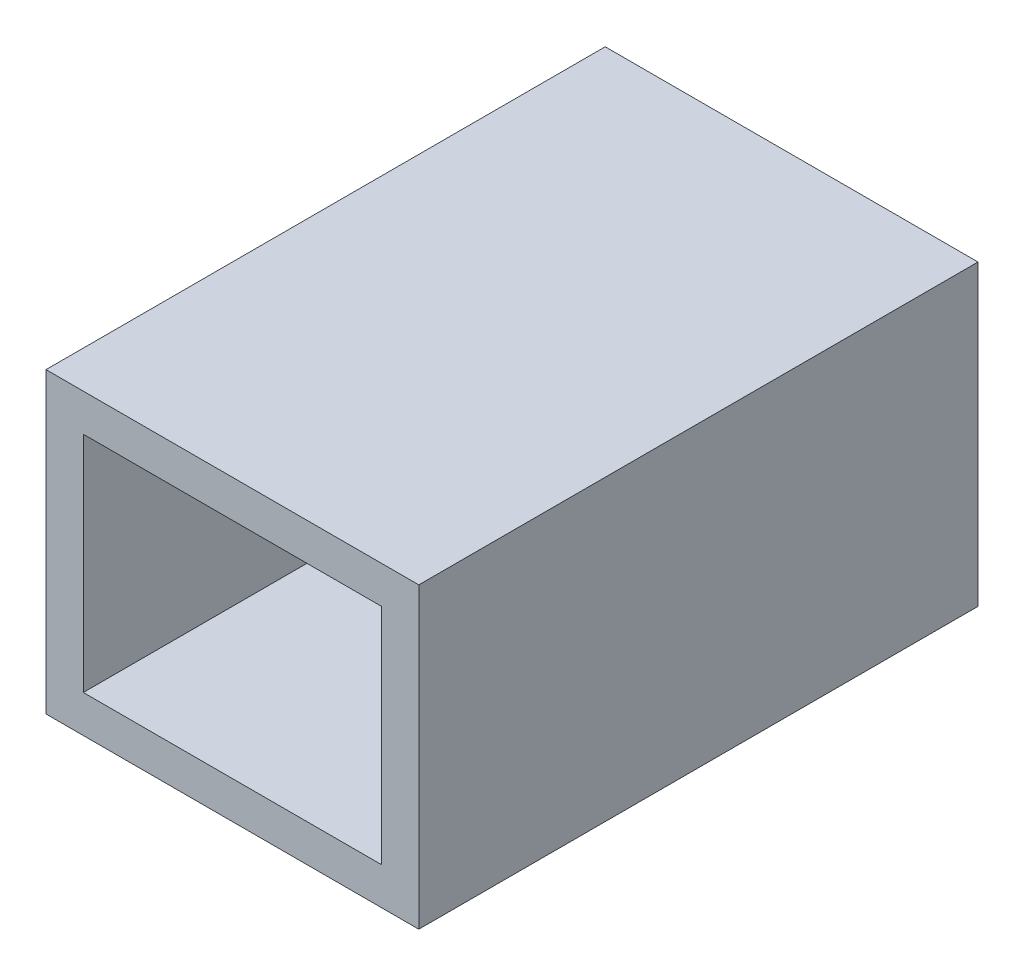
ISO-10303-21;
HEADER;
FILE_DESCRIPTION(('STEP AP214'),'2;1');
FILE_NAME('part.step','',(''),(''),'','','');
FILE_SCHEMA(('AUTOMOTIVE_DESIGN { 1 0 10303 214 1 1 1 1 }'));
ENDSEC;
DATA;
#1=APPLICATION_CONTEXT('core data for automotive mechanical design processes');
#2=APPLICATION_PROTOCOL_DEFINITION('international standard','automotive_design',2000,#1);
#3=PRODUCT_CONTEXT('',#1,'mechanical');
#4=PRODUCT('Part','Part','',(#3));
#5=PRODUCT_RELATED_PRODUCT_CATEGORY('part','',(#4));
#6=PRODUCT_DEFINITION_FORMATION('','',#4);
#7=PRODUCT_DEFINITION_CONTEXT('part definition',#1,'design');
#8=PRODUCT_DEFINITION('design','',#6,#7);
#9=PRODUCT_DEFINITION_SHAPE('','',#8);
#10=(LENGTH_UNIT() NAMED_UNIT(*) SI_UNIT(.MILLI.,.METRE.));
#11=(NAMED_UNIT(*) PLANE_ANGLE_UNIT() SI_UNIT($,.RADIAN.));
#12=(NAMED_UNIT(*) SI_UNIT($,.STERADIAN.) SOLID_ANGLE_UNIT());
#13=UNCERTAINTY_MEASURE_WITH_UNIT(LENGTH_MEASURE(1.E-05),#10,'distance_accuracy_value','');
#14=(GEOMETRIC_REPRESENTATION_CONTEXT(3) GLOBAL_UNCERTAINTY_ASSIGNED_CONTEXT((#13)) GLOBAL_UNIT_ASSIGNED_CONTEXT((#10,
#11,#12)) REPRESENTATION_CONTEXT('',''));
#15=CARTESIAN_POINT('',(0.,0.,0.));
#16=DIRECTION('',(0.,0.,1.));
#17=DIRECTION('',(1.,0.,0.));
#18=AXIS2_PLACEMENT_3D('',#15,#16,#17);
#19=CARTESIAN_POINT('',(0.,0.,150.));
#20=DIRECTION('',(0.,0.,-1.));
#21=DIRECTION('',(-1.,0.,0.));
#22=AXIS2_PLACEMENT_3D('',#19,#20,#21);
#23=PLANE('',#22);
#24=DIRECTION('',(0.,1.,0.));
#25=VECTOR('',#24,1.);
#26=CARTESIAN_POINT('',(50.,-40.,150.));
#27=LINE('',#26,#25);
#28=CARTESIAN_POINT('',(50.,-40.,150.));
#29=VERTEX_POINT('',#28);
#30=CARTESIAN_POINT('',(50.,40.,150.));
#31=VERTEX_POINT('',#30);
#32=EDGE_CURVE('E153',#29,#31,#27,.T.);
#33=ORIENTED_EDGE('',*,*,#32,.T.);
#34=DIRECTION('',(-1.,0.,0.));
#35=VECTOR('',#34,1.);
#36=CARTESIAN_POINT('',(-50.,40.,150.));
#37=LINE('',#36,#35);
#38=CARTESIAN_POINT('',(-50.,40.,150.));
#39=VERTEX_POINT('',#38);
#40=EDGE_CURVE('E157',#31,#39,#37,.T.);
#41=ORIENTED_EDGE('',*,*,#40,.T.);
#42=DIRECTION('',(0.,-1.,0.));
#43=VECTOR('',#42,1.);
#44=CARTESIAN_POINT('',(-50.,-40.,150.));
#45=LINE('',#44,#43);
#46=CARTESIAN_POINT('',(-50.,-40.,150.));
#47=VERTEX_POINT('',#46);
#48=EDGE_CURVE('E161',#39,#47,#45,.T.);
#49=ORIENTED_EDGE('',*,*,#48,.T.);
#50=DIRECTION('',(1.,0.,0.));
#51=VECTOR('',#50,1.);
#52=CARTESIAN_POINT('',(-50.,-40.,150.));
#53=LINE('',#52,#51);
#54=EDGE_CURVE('E164',#47,#29,#53,.T.);
#55=ORIENTED_EDGE('',*,*,#54,.T.);
#56=EDGE_LOOP('',(#33,#41,#49,#55));
#57=FACE_BOUND('',#56,.T.);
#58=DIRECTION('',(0.,1.,0.));
#59=VECTOR('',#58,1.);
#60=CARTESIAN_POINT('',(40.,-30.,150.));
#61=LINE('',#60,#59);
#62=CARTESIAN_POINT('',(40.,-30.,150.));
#63=VERTEX_POINT('',#62);
#64=CARTESIAN_POINT('',(40.,30.,150.));
#65=VERTEX_POINT('',#64);
#66=EDGE_CURVE('E105',#63,#65,#61,.T.);
#67=ORIENTED_EDGE('',*,*,#66,.F.);
#68=DIRECTION('',(1.,0.,0.));
#69=VECTOR('',#68,1.);
#70=CARTESIAN_POINT('',(-40.,-30.,150.));
#71=LINE('',#70,#69);
#72=CARTESIAN_POINT('',(-40.,-30.,150.));
#73=VERTEX_POINT('',#72);
#74=EDGE_CURVE('E131',#73,#63,#71,.T.);
#75=ORIENTED_EDGE('',*,*,#74,.F.);
#76=DIRECTION('',(0.,-1.,0.));
#77=VECTOR('',#76,1.);
#78=CARTESIAN_POINT('',(-40.,-30.,150.));
#79=LINE('',#78,#77);
#80=CARTESIAN_POINT('',(-40.,30.,150.));
#81=VERTEX_POINT('',#80);
#82=EDGE_CURVE('E127',#81,#73,#79,.T.);
#83=ORIENTED_EDGE('',*,*,#82,.F.);
#84=DIRECTION('',(-1.,0.,0.));
#85=VECTOR('',#84,1.);
#86=CARTESIAN_POINT('',(-40.,30.,150.));
#87=LINE('',#86,#85);
#88=EDGE_CURVE('E114',#65,#81,#87,.T.);
#89=ORIENTED_EDGE('',*,*,#88,.F.);
#90=EDGE_LOOP('',(#67,#75,#83,#89));
#91=FACE_BOUND('',#90,.T.);
#92=ADVANCED_FACE('F39',(#57,#91),#23,.F.);
#93=CARTESIAN_POINT('',(0.,0.,0.));
#94=DIRECTION('',(0.,0.,-1.));
#95=DIRECTION('',(-1.,0.,0.));
#96=AXIS2_PLACEMENT_3D('',#93,#94,#95);
#97=PLANE('',#96);
#98=DIRECTION('',(0.,1.,0.));
#99=VECTOR('',#98,1.);
#100=CARTESIAN_POINT('',(50.,-40.,0.));
#101=LINE('',#100,#99);
#102=CARTESIAN_POINT('',(50.,-40.,0.));
#103=VERTEX_POINT('',#102);
#104=CARTESIAN_POINT('',(50.,40.,0.));
#105=VERTEX_POINT('',#104);
#106=EDGE_CURVE('E123',#103,#105,#101,.T.);
#107=ORIENTED_EDGE('',*,*,#106,.F.);
#108=DIRECTION('',(1.,0.,0.));
#109=VECTOR('',#108,1.);
#110=CARTESIAN_POINT('',(-50.,-40.,0.));
#111=LINE('',#110,#109);
#112=CARTESIAN_POINT('',(-50.,-40.,0.));
#113=VERTEX_POINT('',#112);
#114=EDGE_CURVE('E158',#113,#103,#111,.T.);
#115=ORIENTED_EDGE('',*,*,#114,.F.);
#116=DIRECTION('',(0.,-1.,0.));
#117=VECTOR('',#116,1.);
#118=CARTESIAN_POINT('',(-50.,-40.,0.));
#119=LINE('',#118,#117);
#120=CARTESIAN_POINT('',(-50.,40.,0.));
#121=VERTEX_POINT('',#120);
#122=EDGE_CURVE('E174',#121,#113,#119,.T.);
#123=ORIENTED_EDGE('',*,*,#122,.F.);
#124=DIRECTION('',(-1.,0.,0.));
#125=VECTOR('',#124,1.);
#126=CARTESIAN_POINT('',(-50.,40.,0.));
#127=LINE('',#126,#125);
#128=EDGE_CURVE('E171',#105,#121,#127,.T.);
#129=ORIENTED_EDGE('',*,*,#128,.F.);
#130=EDGE_LOOP('',(#107,#115,#123,#129));
#131=FACE_BOUND('',#130,.T.);
#132=DIRECTION('',(1.,0.,0.));
#133=VECTOR('',#132,1.);
#134=CARTESIAN_POINT('',(-40.,-30.,0.));
#135=LINE('',#134,#133);
#136=CARTESIAN_POINT('',(-40.,-30.,0.));
#137=VERTEX_POINT('',#136);
#138=CARTESIAN_POINT('',(40.,-30.,0.));
#139=VERTEX_POINT('',#138);
#140=EDGE_CURVE('E115',#137,#139,#135,.T.);
#141=ORIENTED_EDGE('',*,*,#140,.T.);
#142=DIRECTION('',(0.,1.,0.));
#143=VECTOR('',#142,1.);
#144=CARTESIAN_POINT('',(40.,-30.,0.));
#145=LINE('',#144,#143);
#146=CARTESIAN_POINT('',(40.,30.,0.));
#147=VERTEX_POINT('',#146);
#148=EDGE_CURVE('E63',#139,#147,#145,.T.);
#149=ORIENTED_EDGE('',*,*,#148,.T.);
#150=DIRECTION('',(-1.,0.,0.));
#151=VECTOR('',#150,1.);
#152=CARTESIAN_POINT('',(-40.,30.,0.));
#153=LINE('',#152,#151);
#154=CARTESIAN_POINT('',(-40.,30.,0.));
#155=VERTEX_POINT('',#154);
#156=EDGE_CURVE('E121',#147,#155,#153,.T.);
#157=ORIENTED_EDGE('',*,*,#156,.T.);
#158=DIRECTION('',(0.,-1.,0.));
#159=VECTOR('',#158,1.);
#160=CARTESIAN_POINT('',(-40.,-30.,0.));
#161=LINE('',#160,#159);
#162=EDGE_CURVE('E140',#155,#137,#161,.T.);
#163=ORIENTED_EDGE('',*,*,#162,.T.);
#164=EDGE_LOOP('',(#141,#149,#157,#163));
#165=FACE_BOUND('',#164,.T.);
#166=ADVANCED_FACE('F197',(#131,#165),#97,.T.);
#167=CARTESIAN_POINT('',(50.,-40.,150.));
#168=DIRECTION('',(-1.,0.,0.));
#169=DIRECTION('',(0.,0.,1.));
#170=AXIS2_PLACEMENT_3D('',#167,#168,#169);
#171=PLANE('',#170);
#172=ORIENTED_EDGE('',*,*,#106,.T.);
#173=DIRECTION('',(0.,0.,-1.));
#174=VECTOR('',#173,1.);
#175=CARTESIAN_POINT('',(50.,40.,150.));
#176=LINE('',#175,#174);
#177=EDGE_CURVE('E11',#31,#105,#176,.T.);
#178=ORIENTED_EDGE('',*,*,#177,.F.);
#179=ORIENTED_EDGE('',*,*,#32,.F.);
#180=DIRECTION('',(0.,0.,-1.));
#181=VECTOR('',#180,1.);
#182=CARTESIAN_POINT('',(50.,-40.,150.));
#183=LINE('',#182,#181);
#184=EDGE_CURVE('E167',#29,#103,#183,.T.);
#185=ORIENTED_EDGE('',*,*,#184,.T.);
#186=EDGE_LOOP('',(#172,#178,#179,#185));
#187=FACE_BOUND('',#186,.T.);
#188=ADVANCED_FACE('F41',(#187),#171,.F.);
#189=CARTESIAN_POINT('',(-50.,40.,150.));
#190=DIRECTION('',(0.,-1.,0.));
#191=DIRECTION('',(0.,0.,-1.));
#192=AXIS2_PLACEMENT_3D('',#189,#190,#191);
#193=PLANE('',#192);
#194=ORIENTED_EDGE('',*,*,#128,.T.);
#195=DIRECTION('',(0.,0.,-1.));
#196=VECTOR('',#195,1.);
#197=CARTESIAN_POINT('',(-50.,40.,150.));
#198=LINE('',#197,#196);
#199=EDGE_CURVE('E48',#39,#121,#198,.T.);
#200=ORIENTED_EDGE('',*,*,#199,.F.);
#201=ORIENTED_EDGE('',*,*,#40,.F.);
#202=ORIENTED_EDGE('',*,*,#177,.T.);
#203=EDGE_LOOP('',(#194,#200,#201,#202));
#204=FACE_BOUND('',#203,.T.);
#205=ADVANCED_FACE('F207',(#204),#193,.F.);
#206=CARTESIAN_POINT('',(-50.,-40.,150.));
#207=DIRECTION('',(1.,0.,0.));
#208=DIRECTION('',(0.,0.,-1.));
#209=AXIS2_PLACEMENT_3D('',#206,#207,#208);
#210=PLANE('',#209);
#211=ORIENTED_EDGE('',*,*,#122,.T.);
#212=DIRECTION('',(0.,0.,-1.));
#213=VECTOR('',#212,1.);
#214=CARTESIAN_POINT('',(-50.,-40.,150.));
#215=LINE('',#214,#213);
#216=EDGE_CURVE('E182',#47,#113,#215,.T.);
#217=ORIENTED_EDGE('',*,*,#216,.F.);
#218=ORIENTED_EDGE('',*,*,#48,.F.);
#219=ORIENTED_EDGE('',*,*,#199,.T.);
#220=EDGE_LOOP('',(#211,#217,#218,#219));
#221=FACE_BOUND('',#220,.T.);
#222=ADVANCED_FACE('F191',(#221),#210,.F.);
#223=CARTESIAN_POINT('',(-50.,-40.,150.));
#224=DIRECTION('',(0.,1.,0.));
#225=DIRECTION('',(0.,0.,1.));
#226=AXIS2_PLACEMENT_3D('',#223,#224,#225);
#227=PLANE('',#226);
#228=ORIENTED_EDGE('',*,*,#114,.T.);
#229=ORIENTED_EDGE('',*,*,#184,.F.);
#230=ORIENTED_EDGE('',*,*,#54,.F.);
#231=ORIENTED_EDGE('',*,*,#216,.T.);
#232=EDGE_LOOP('',(#228,#229,#230,#231));
#233=FACE_BOUND('',#232,.T.);
#234=ADVANCED_FACE('F201',(#233),#227,.F.);
#235=CARTESIAN_POINT('',(40.,-30.,150.));
#236=DIRECTION('',(-1.,0.,0.));
#237=DIRECTION('',(0.,0.,1.));
#238=AXIS2_PLACEMENT_3D('',#235,#236,#237);
#239=PLANE('',#238);
#240=ORIENTED_EDGE('',*,*,#148,.F.);
#241=DIRECTION('',(0.,0.,-1.));
#242=VECTOR('',#241,1.);
#243=CARTESIAN_POINT('',(40.,-30.,150.));
#244=LINE('',#243,#242);
#245=EDGE_CURVE('E109',#63,#139,#244,.T.);
#246=ORIENTED_EDGE('',*,*,#245,.F.);
#247=ORIENTED_EDGE('',*,*,#66,.T.);
#248=DIRECTION('',(0.,0.,-1.));
#249=VECTOR('',#248,1.);
#250=CARTESIAN_POINT('',(40.,30.,150.));
#251=LINE('',#250,#249);
#252=EDGE_CURVE('E108',#65,#147,#251,.T.);
#253=ORIENTED_EDGE('',*,*,#252,.T.);
#254=EDGE_LOOP('',(#240,#246,#247,#253));
#255=FACE_BOUND('',#254,.T.);
#256=ADVANCED_FACE('F107',(#255),#239,.T.);
#257=CARTESIAN_POINT('',(-40.,30.,150.));
#258=DIRECTION('',(0.,-1.,0.));
#259=DIRECTION('',(0.,0.,-1.));
#260=AXIS2_PLACEMENT_3D('',#257,#258,#259);
#261=PLANE('',#260);
#262=ORIENTED_EDGE('',*,*,#156,.F.);
#263=ORIENTED_EDGE('',*,*,#252,.F.);
#264=ORIENTED_EDGE('',*,*,#88,.T.);
#265=DIRECTION('',(0.,0.,-1.));
#266=VECTOR('',#265,1.);
#267=CARTESIAN_POINT('',(-40.,30.,150.));
#268=LINE('',#267,#266);
#269=EDGE_CURVE('E124',#81,#155,#268,.T.);
#270=ORIENTED_EDGE('',*,*,#269,.T.);
#271=EDGE_LOOP('',(#262,#263,#264,#270));
#272=FACE_BOUND('',#271,.T.);
#273=ADVANCED_FACE('F118',(#272),#261,.T.);
#274=CARTESIAN_POINT('',(-40.,-30.,150.));
#275=DIRECTION('',(1.,0.,0.));
#276=DIRECTION('',(0.,0.,-1.));
#277=AXIS2_PLACEMENT_3D('',#274,#275,#276);
#278=PLANE('',#277);
#279=ORIENTED_EDGE('',*,*,#162,.F.);
#280=ORIENTED_EDGE('',*,*,#269,.F.);
#281=ORIENTED_EDGE('',*,*,#82,.T.);
#282=DIRECTION('',(0.,0.,-1.));
#283=VECTOR('',#282,1.);
#284=CARTESIAN_POINT('',(-40.,-30.,150.));
#285=LINE('',#284,#283);
#286=EDGE_CURVE('E55',#73,#137,#285,.T.);
#287=ORIENTED_EDGE('',*,*,#286,.T.);
#288=EDGE_LOOP('',(#279,#280,#281,#287));
#289=FACE_BOUND('',#288,.T.);
#290=ADVANCED_FACE('F230',(#289),#278,.T.);
#291=CARTESIAN_POINT('',(-40.,-30.,150.));
#292=DIRECTION('',(0.,1.,0.));
#293=DIRECTION('',(0.,0.,1.));
#294=AXIS2_PLACEMENT_3D('',#291,#292,#293);
#295=PLANE('',#294);
#296=ORIENTED_EDGE('',*,*,#140,.F.);
#297=ORIENTED_EDGE('',*,*,#286,.F.);
#298=ORIENTED_EDGE('',*,*,#74,.T.);
#299=ORIENTED_EDGE('',*,*,#245,.T.);
#300=EDGE_LOOP('',(#296,#297,#298,#299));
#301=FACE_BOUND('',#300,.T.);
#302=ADVANCED_FACE('F234',(#301),#295,.T.);
#303=CLOSED_SHELL('',(#92,#166,#188,#205,#222,#234,#256,#273,#290,#302));
#304=MANIFOLD_SOLID_BREP('B2',#303);
#305=ADVANCED_BREP_SHAPE_REPRESENTATION('',(#18,#304),#14);
#306=SHAPE_DEFINITION_REPRESENTATION(#9,#305);
ENDSEC;
END-ISO-10303-21;
